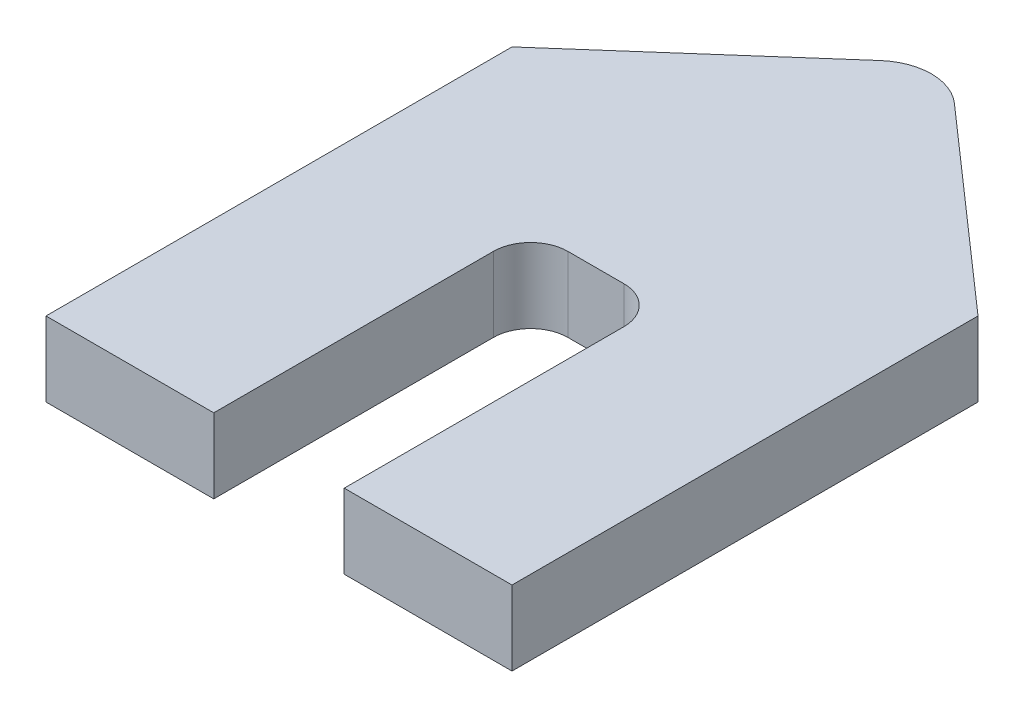
ISO-10303-21;
HEADER;
FILE_DESCRIPTION(('STEP AP214'),'2;1');
FILE_NAME('part.step','',(''),(''),'','','');
FILE_SCHEMA(('AUTOMOTIVE_DESIGN { 1 0 10303 214 1 1 1 1 }'));
ENDSEC;
DATA;
#1=APPLICATION_CONTEXT('core data for automotive mechanical design processes');
#2=APPLICATION_PROTOCOL_DEFINITION('international standard','automotive_design',2000,#1);
#3=PRODUCT_CONTEXT('',#1,'mechanical');
#4=PRODUCT('Part','Part','',(#3));
#5=PRODUCT_RELATED_PRODUCT_CATEGORY('part','',(#4));
#6=PRODUCT_DEFINITION_FORMATION('','',#4);
#7=PRODUCT_DEFINITION_CONTEXT('part definition',#1,'design');
#8=PRODUCT_DEFINITION('design','',#6,#7);
#9=PRODUCT_DEFINITION_SHAPE('','',#8);
#10=(LENGTH_UNIT() NAMED_UNIT(*) SI_UNIT(.MILLI.,.METRE.));
#11=(NAMED_UNIT(*) PLANE_ANGLE_UNIT() SI_UNIT($,.RADIAN.));
#12=(NAMED_UNIT(*) SI_UNIT($,.STERADIAN.) SOLID_ANGLE_UNIT());
#13=UNCERTAINTY_MEASURE_WITH_UNIT(LENGTH_MEASURE(1.E-05),#10,'distance_accuracy_value','');
#14=(GEOMETRIC_REPRESENTATION_CONTEXT(3) GLOBAL_UNCERTAINTY_ASSIGNED_CONTEXT((#13)) GLOBAL_UNIT_ASSIGNED_CONTEXT((#10,
#11,#12)) REPRESENTATION_CONTEXT('',''));
#15=CARTESIAN_POINT('',(0.,0.,0.));
#16=DIRECTION('',(0.,0.,1.));
#17=DIRECTION('',(1.,0.,0.));
#18=AXIS2_PLACEMENT_3D('',#15,#16,#17);
#19=CARTESIAN_POINT('',(-12.5,2.,12.5));
#20=DIRECTION('',(0.,0.,-1.));
#21=DIRECTION('',(-1.,0.,0.));
#22=AXIS2_PLACEMENT_3D('',#19,#20,#21);
#23=PLANE('',#22);
#24=DIRECTION('',(1.,0.,0.));
#25=VECTOR('',#24,1.);
#26=CARTESIAN_POINT('',(-12.5,-2.,12.5));
#27=LINE('',#26,#25);
#28=CARTESIAN_POINT('',(-12.5,-2.,12.5));
#29=VERTEX_POINT('',#28);
#30=CARTESIAN_POINT('',(-3.5,-2.,12.5));
#31=VERTEX_POINT('',#30);
#32=EDGE_CURVE('E123',#29,#31,#27,.T.);
#33=ORIENTED_EDGE('',*,*,#32,.T.);
#34=DIRECTION('',(0.,1.,0.));
#35=VECTOR('',#34,1.);
#36=CARTESIAN_POINT('',(-3.5,-2.001,12.5));
#37=LINE('',#36,#35);
#38=CARTESIAN_POINT('',(-3.5,2.,12.5));
#39=VERTEX_POINT('',#38);
#40=EDGE_CURVE('E129',#31,#39,#37,.T.);
#41=ORIENTED_EDGE('',*,*,#40,.T.);
#42=DIRECTION('',(1.,0.,0.));
#43=VECTOR('',#42,1.);
#44=CARTESIAN_POINT('',(-12.5,2.,12.5));
#45=LINE('',#44,#43);
#46=CARTESIAN_POINT('',(-12.5,2.,12.5));
#47=VERTEX_POINT('',#46);
#48=EDGE_CURVE('E226',#47,#39,#45,.T.);
#49=ORIENTED_EDGE('',*,*,#48,.F.);
#50=DIRECTION('',(0.,-1.,0.));
#51=VECTOR('',#50,1.);
#52=CARTESIAN_POINT('',(-12.5,2.,12.5));
#53=LINE('',#52,#51);
#54=EDGE_CURVE('E140',#47,#29,#53,.T.);
#55=ORIENTED_EDGE('',*,*,#54,.T.);
#56=EDGE_LOOP('',(#33,#41,#49,#55));
#57=FACE_BOUND('',#56,.T.);
#58=ADVANCED_FACE('F32',(#57),#23,.F.);
#59=CARTESIAN_POINT('',(12.5,2.,-12.5));
#60=DIRECTION('',(-0.660474933412196,0.,0.750848095378922));
#61=DIRECTION('',(0.750848095378922,0.,0.660474933412196));
#62=AXIS2_PLACEMENT_3D('',#59,#60,#61);
#63=PLANE('',#62);
#64=DIRECTION('',(-0.750848095378922,0.,-0.660474933412196));
#65=VECTOR('',#64,1.);
#66=CARTESIAN_POINT('',(12.5,-2.,-12.5));
#67=LINE('',#66,#65);
#68=CARTESIAN_POINT('',(12.5,-2.,-12.5));
#69=VERTEX_POINT('',#68);
#70=CARTESIAN_POINT('',(1.98142480023659,-2.,-21.7525442861368));
#71=VERTEX_POINT('',#70);
#72=EDGE_CURVE('E234',#69,#71,#67,.T.);
#73=ORIENTED_EDGE('',*,*,#72,.T.);
#74=DIRECTION('',(0.,-1.,0.));
#75=VECTOR('',#74,1.);
#76=CARTESIAN_POINT('',(1.98142480023659,2.,-21.7525442861368));
#77=LINE('',#76,#75);
#78=CARTESIAN_POINT('',(1.98142480023659,2.,-21.7525442861368));
#79=VERTEX_POINT('',#78);
#80=EDGE_CURVE('E164',#79,#71,#77,.T.);
#81=ORIENTED_EDGE('',*,*,#80,.F.);
#82=DIRECTION('',(-0.750848095378922,0.,-0.660474933412196));
#83=VECTOR('',#82,1.);
#84=CARTESIAN_POINT('',(12.5,2.,-12.5));
#85=LINE('',#84,#83);
#86=CARTESIAN_POINT('',(12.5,2.,-12.5));
#87=VERTEX_POINT('',#86);
#88=EDGE_CURVE('E144',#87,#79,#85,.T.);
#89=ORIENTED_EDGE('',*,*,#88,.F.);
#90=DIRECTION('',(0.,-1.,0.));
#91=VECTOR('',#90,1.);
#92=CARTESIAN_POINT('',(12.5,2.,-12.5));
#93=LINE('',#92,#91);
#94=EDGE_CURVE('E150',#87,#69,#93,.T.);
#95=ORIENTED_EDGE('',*,*,#94,.T.);
#96=EDGE_LOOP('',(#73,#81,#89,#95));
#97=FACE_BOUND('',#96,.T.);
#98=ADVANCED_FACE('F197',(#97),#63,.F.);
#99=CARTESIAN_POINT('',(0.,2.,-19.5));
#100=DIRECTION('',(0.,-1.,0.));
#101=DIRECTION('',(0.,0.,-1.));
#102=AXIS2_PLACEMENT_3D('',#99,#100,#101);
#103=CYLINDRICAL_SURFACE('',#102,3.);
#104=CARTESIAN_POINT('',(0.,-2.,-19.5));
#105=DIRECTION('',(0.,1.,0.));
#106=DIRECTION('',(0.,0.,-1.));
#107=AXIS2_PLACEMENT_3D('',#104,#105,#106);
#108=CIRCLE('',#107,3.);
#109=CARTESIAN_POINT('',(-1.98142480023659,-2.,-21.7525442861368));
#110=VERTEX_POINT('',#109);
#111=EDGE_CURVE('E237',#71,#110,#108,.T.);
#112=ORIENTED_EDGE('',*,*,#111,.T.);
#113=DIRECTION('',(0.,-1.,0.));
#114=VECTOR('',#113,1.);
#115=CARTESIAN_POINT('',(-1.98142480023659,2.,-21.7525442861368));
#116=LINE('',#115,#114);
#117=CARTESIAN_POINT('',(-1.98142480023659,2.,-21.7525442861368));
#118=VERTEX_POINT('',#117);
#119=EDGE_CURVE('E161',#118,#110,#116,.T.);
#120=ORIENTED_EDGE('',*,*,#119,.F.);
#121=CARTESIAN_POINT('',(0.,2.,-19.5));
#122=DIRECTION('',(0.,1.,0.));
#123=DIRECTION('',(0.,0.,-1.));
#124=AXIS2_PLACEMENT_3D('',#121,#122,#123);
#125=CIRCLE('',#124,3.);
#126=EDGE_CURVE('E248',#79,#118,#125,.T.);
#127=ORIENTED_EDGE('',*,*,#126,.F.);
#128=ORIENTED_EDGE('',*,*,#80,.T.);
#129=EDGE_LOOP('',(#112,#120,#127,#128));
#130=FACE_BOUND('',#129,.T.);
#131=ADVANCED_FACE('F203',(#130),#103,.T.);
#132=CARTESIAN_POINT('',(-12.5,2.,-12.5));
#133=DIRECTION('',(0.660474933412196,0.,0.750848095378922));
#134=DIRECTION('',(0.750848095378922,0.,-0.660474933412196));
#135=AXIS2_PLACEMENT_3D('',#132,#133,#134);
#136=PLANE('',#135);
#137=DIRECTION('',(-0.750848095378922,0.,0.660474933412196));
#138=VECTOR('',#137,1.);
#139=CARTESIAN_POINT('',(-12.5,-2.,-12.5));
#140=LINE('',#139,#138);
#141=CARTESIAN_POINT('',(-12.5,-2.,-12.5));
#142=VERTEX_POINT('',#141);
#143=EDGE_CURVE('E238',#110,#142,#140,.T.);
#144=ORIENTED_EDGE('',*,*,#143,.T.);
#145=DIRECTION('',(0.,-1.,0.));
#146=VECTOR('',#145,1.);
#147=CARTESIAN_POINT('',(-12.5,2.,-12.5));
#148=LINE('',#147,#146);
#149=CARTESIAN_POINT('',(-12.5,2.,-12.5));
#150=VERTEX_POINT('',#149);
#151=EDGE_CURVE('E158',#150,#142,#148,.T.);
#152=ORIENTED_EDGE('',*,*,#151,.F.);
#153=DIRECTION('',(-0.750848095378922,0.,0.660474933412196));
#154=VECTOR('',#153,1.);
#155=CARTESIAN_POINT('',(-12.5,2.,-12.5));
#156=LINE('',#155,#154);
#157=EDGE_CURVE('E229',#118,#150,#156,.T.);
#158=ORIENTED_EDGE('',*,*,#157,.F.);
#159=ORIENTED_EDGE('',*,*,#119,.T.);
#160=EDGE_LOOP('',(#144,#152,#158,#159));
#161=FACE_BOUND('',#160,.T.);
#162=ADVANCED_FACE('F217',(#161),#136,.F.);
#163=CARTESIAN_POINT('',(-12.5,2.,12.5));
#164=DIRECTION('',(1.,0.,0.));
#165=DIRECTION('',(0.,0.,-1.));
#166=AXIS2_PLACEMENT_3D('',#163,#164,#165);
#167=PLANE('',#166);
#168=DIRECTION('',(0.,0.,1.));
#169=VECTOR('',#168,1.);
#170=CARTESIAN_POINT('',(-12.5,-2.,12.5));
#171=LINE('',#170,#169);
#172=EDGE_CURVE('E146',#142,#29,#171,.T.);
#173=ORIENTED_EDGE('',*,*,#172,.T.);
#174=ORIENTED_EDGE('',*,*,#54,.F.);
#175=DIRECTION('',(0.,0.,1.));
#176=VECTOR('',#175,1.);
#177=CARTESIAN_POINT('',(-12.5,2.,12.5));
#178=LINE('',#177,#176);
#179=EDGE_CURVE('E227',#150,#47,#178,.T.);
#180=ORIENTED_EDGE('',*,*,#179,.F.);
#181=ORIENTED_EDGE('',*,*,#151,.T.);
#182=EDGE_LOOP('',(#173,#174,#180,#181));
#183=FACE_BOUND('',#182,.T.);
#184=ADVANCED_FACE('F210',(#183),#167,.F.);
#185=CARTESIAN_POINT('',(3.5,2.,12.5));
#186=VERTEX_POINT('',#185);
#187=CARTESIAN_POINT('',(12.5,2.,12.5));
#188=VERTEX_POINT('',#187);
#189=EDGE_CURVE('E222',#186,#188,#45,.T.);
#190=ORIENTED_EDGE('',*,*,#189,.F.);
#191=DIRECTION('',(0.,1.,0.));
#192=VECTOR('',#191,1.);
#193=CARTESIAN_POINT('',(3.5,-2.001,12.5));
#194=LINE('',#193,#192);
#195=CARTESIAN_POINT('',(3.5,-2.,12.5));
#196=VERTEX_POINT('',#195);
#197=EDGE_CURVE('E135',#196,#186,#194,.T.);
#198=ORIENTED_EDGE('',*,*,#197,.F.);
#199=CARTESIAN_POINT('',(12.5,-2.,12.5));
#200=VERTEX_POINT('',#199);
#201=EDGE_CURVE('E142',#196,#200,#27,.T.);
#202=ORIENTED_EDGE('',*,*,#201,.T.);
#203=DIRECTION('',(0.,-1.,0.));
#204=VECTOR('',#203,1.);
#205=CARTESIAN_POINT('',(12.5,2.,12.5));
#206=LINE('',#205,#204);
#207=EDGE_CURVE('E153',#188,#200,#206,.T.);
#208=ORIENTED_EDGE('',*,*,#207,.F.);
#209=EDGE_LOOP('',(#190,#198,#202,#208));
#210=FACE_BOUND('',#209,.T.);
#211=ADVANCED_FACE('F199',(#210),#23,.F.);
#212=CARTESIAN_POINT('',(12.5,2.,12.5));
#213=DIRECTION('',(-1.,0.,0.));
#214=DIRECTION('',(0.,0.,1.));
#215=AXIS2_PLACEMENT_3D('',#212,#213,#214);
#216=PLANE('',#215);
#217=DIRECTION('',(0.,0.,-1.));
#218=VECTOR('',#217,1.);
#219=CARTESIAN_POINT('',(12.5,-2.,12.5));
#220=LINE('',#219,#218);
#221=EDGE_CURVE('E141',#200,#69,#220,.T.);
#222=ORIENTED_EDGE('',*,*,#221,.T.);
#223=ORIENTED_EDGE('',*,*,#94,.F.);
#224=DIRECTION('',(0.,0.,-1.));
#225=VECTOR('',#224,1.);
#226=CARTESIAN_POINT('',(12.5,2.,12.5));
#227=LINE('',#226,#225);
#228=EDGE_CURVE('E154',#188,#87,#227,.T.);
#229=ORIENTED_EDGE('',*,*,#228,.F.);
#230=ORIENTED_EDGE('',*,*,#207,.T.);
#231=EDGE_LOOP('',(#222,#223,#229,#230));
#232=FACE_BOUND('',#231,.T.);
#233=ADVANCED_FACE('F209',(#232),#216,.F.);
#234=CARTESIAN_POINT('',(0.,2.,-19.5));
#235=DIRECTION('',(0.,-1.,0.));
#236=DIRECTION('',(0.,0.,-1.));
#237=AXIS2_PLACEMENT_3D('',#234,#235,#236);
#238=PLANE('',#237);
#239=ORIENTED_EDGE('',*,*,#48,.T.);
#240=DIRECTION('',(0.,0.,1.));
#241=VECTOR('',#240,1.);
#242=CARTESIAN_POINT('',(-3.5,2.,12.5));
#243=LINE('',#242,#241);
#244=CARTESIAN_POINT('',(-3.5,2.,-2.5));
#245=VERTEX_POINT('',#244);
#246=EDGE_CURVE('E125',#245,#39,#243,.T.);
#247=ORIENTED_EDGE('',*,*,#246,.F.);
#248=CARTESIAN_POINT('',(-1.5,2.,-2.5));
#249=DIRECTION('',(0.,-1.,0.));
#250=DIRECTION('',(0.,0.,-1.));
#251=AXIS2_PLACEMENT_3D('',#248,#249,#250);
#252=CIRCLE('',#251,2.);
#253=CARTESIAN_POINT('',(-1.5,2.,-4.5));
#254=VERTEX_POINT('',#253);
#255=EDGE_CURVE('E40',#245,#254,#252,.T.);
#256=ORIENTED_EDGE('',*,*,#255,.T.);
#257=DIRECTION('',(-1.,0.,0.));
#258=VECTOR('',#257,1.);
#259=CARTESIAN_POINT('',(-3.5,2.,-4.5));
#260=LINE('',#259,#258);
#261=CARTESIAN_POINT('',(1.5,2.,-4.5));
#262=VERTEX_POINT('',#261);
#263=EDGE_CURVE('E136',#262,#254,#260,.T.);
#264=ORIENTED_EDGE('',*,*,#263,.F.);
#265=CARTESIAN_POINT('',(1.5,2.,-2.5));
#266=DIRECTION('',(0.,-1.,0.));
#267=DIRECTION('',(0.,0.,-1.));
#268=AXIS2_PLACEMENT_3D('',#265,#266,#267);
#269=CIRCLE('',#268,2.);
#270=CARTESIAN_POINT('',(3.5,2.,-2.5));
#271=VERTEX_POINT('',#270);
#272=EDGE_CURVE('E176',#262,#271,#269,.T.);
#273=ORIENTED_EDGE('',*,*,#272,.T.);
#274=DIRECTION('',(0.,0.,-1.));
#275=VECTOR('',#274,1.);
#276=CARTESIAN_POINT('',(3.5,2.,12.5));
#277=LINE('',#276,#275);
#278=EDGE_CURVE('E187',#186,#271,#277,.T.);
#279=ORIENTED_EDGE('',*,*,#278,.F.);
#280=ORIENTED_EDGE('',*,*,#189,.T.);
#281=ORIENTED_EDGE('',*,*,#228,.T.);
#282=ORIENTED_EDGE('',*,*,#88,.T.);
#283=ORIENTED_EDGE('',*,*,#126,.T.);
#284=ORIENTED_EDGE('',*,*,#157,.T.);
#285=ORIENTED_EDGE('',*,*,#179,.T.);
#286=EDGE_LOOP('',(#239,#247,#256,#264,#273,#279,#280,#281,#282,#283,#284,#285));
#287=FACE_BOUND('',#286,.T.);
#288=ADVANCED_FACE('F182',(#287),#238,.F.);
#289=CARTESIAN_POINT('',(0.,-2.,-19.5));
#290=DIRECTION('',(0.,-1.,0.));
#291=DIRECTION('',(0.,0.,-1.));
#292=AXIS2_PLACEMENT_3D('',#289,#290,#291);
#293=PLANE('',#292);
#294=DIRECTION('',(-1.,0.,0.));
#295=VECTOR('',#294,1.);
#296=CARTESIAN_POINT('',(-3.5,-2.,-4.5));
#297=LINE('',#296,#295);
#298=CARTESIAN_POINT('',(1.5,-2.,-4.5));
#299=VERTEX_POINT('',#298);
#300=CARTESIAN_POINT('',(-1.5,-2.,-4.5));
#301=VERTEX_POINT('',#300);
#302=EDGE_CURVE('E126',#299,#301,#297,.T.);
#303=ORIENTED_EDGE('',*,*,#302,.T.);
#304=CARTESIAN_POINT('',(-1.5,-2.,-2.5));
#305=DIRECTION('',(0.,-1.,0.));
#306=DIRECTION('',(0.,0.,-1.));
#307=AXIS2_PLACEMENT_3D('',#304,#305,#306);
#308=CIRCLE('',#307,2.);
#309=CARTESIAN_POINT('',(-3.5,-2.,-2.5));
#310=VERTEX_POINT('',#309);
#311=EDGE_CURVE('E11',#301,#310,#308,.F.);
#312=ORIENTED_EDGE('',*,*,#311,.T.);
#313=DIRECTION('',(0.,0.,1.));
#314=VECTOR('',#313,1.);
#315=CARTESIAN_POINT('',(-3.5,-2.,12.5));
#316=LINE('',#315,#314);
#317=EDGE_CURVE('E118',#310,#31,#316,.T.);
#318=ORIENTED_EDGE('',*,*,#317,.T.);
#319=ORIENTED_EDGE('',*,*,#32,.F.);
#320=ORIENTED_EDGE('',*,*,#172,.F.);
#321=ORIENTED_EDGE('',*,*,#143,.F.);
#322=ORIENTED_EDGE('',*,*,#111,.F.);
#323=ORIENTED_EDGE('',*,*,#72,.F.);
#324=ORIENTED_EDGE('',*,*,#221,.F.);
#325=ORIENTED_EDGE('',*,*,#201,.F.);
#326=DIRECTION('',(0.,0.,-1.));
#327=VECTOR('',#326,1.);
#328=CARTESIAN_POINT('',(3.5,-2.,12.5));
#329=LINE('',#328,#327);
#330=CARTESIAN_POINT('',(3.5,-2.,-2.5));
#331=VERTEX_POINT('',#330);
#332=EDGE_CURVE('E253',#196,#331,#329,.T.);
#333=ORIENTED_EDGE('',*,*,#332,.T.);
#334=CARTESIAN_POINT('',(1.5,-2.,-2.5));
#335=DIRECTION('',(0.,-1.,0.));
#336=DIRECTION('',(0.,0.,-1.));
#337=AXIS2_PLACEMENT_3D('',#334,#335,#336);
#338=CIRCLE('',#337,2.);
#339=EDGE_CURVE('E178',#331,#299,#338,.F.);
#340=ORIENTED_EDGE('',*,*,#339,.T.);
#341=EDGE_LOOP('',(#303,#312,#318,#319,#320,#321,#322,#323,#324,#325,#333,#340));
#342=FACE_BOUND('',#341,.T.);
#343=ADVANCED_FACE('F120',(#342),#293,.T.);
#344=CARTESIAN_POINT('',(-3.5,-2.001,12.5));
#345=DIRECTION('',(-1.,0.,0.));
#346=DIRECTION('',(0.,0.,1.));
#347=AXIS2_PLACEMENT_3D('',#344,#345,#346);
#348=PLANE('',#347);
#349=ORIENTED_EDGE('',*,*,#317,.F.);
#350=DIRECTION('',(0.,1.,0.));
#351=VECTOR('',#350,1.);
#352=CARTESIAN_POINT('',(-3.5,2.,-2.5));
#353=LINE('',#352,#351);
#354=EDGE_CURVE('E174',#310,#245,#353,.T.);
#355=ORIENTED_EDGE('',*,*,#354,.T.);
#356=ORIENTED_EDGE('',*,*,#246,.T.);
#357=ORIENTED_EDGE('',*,*,#40,.F.);
#358=EDGE_LOOP('',(#349,#355,#356,#357));
#359=FACE_BOUND('',#358,.T.);
#360=ADVANCED_FACE('F130',(#359),#348,.F.);
#361=CARTESIAN_POINT('',(-3.5,-2.001,-4.5));
#362=DIRECTION('',(0.,0.,-1.));
#363=DIRECTION('',(-1.,0.,0.));
#364=AXIS2_PLACEMENT_3D('',#361,#362,#363);
#365=PLANE('',#364);
#366=ORIENTED_EDGE('',*,*,#302,.F.);
#367=DIRECTION('',(0.,1.,0.));
#368=VECTOR('',#367,1.);
#369=CARTESIAN_POINT('',(1.5,2.,-4.5));
#370=LINE('',#369,#368);
#371=EDGE_CURVE('E169',#299,#262,#370,.T.);
#372=ORIENTED_EDGE('',*,*,#371,.T.);
#373=ORIENTED_EDGE('',*,*,#263,.T.);
#374=DIRECTION('',(0.,1.,0.));
#375=VECTOR('',#374,1.);
#376=CARTESIAN_POINT('',(-1.5,-2.,-4.5));
#377=LINE('',#376,#375);
#378=EDGE_CURVE('E167',#254,#301,#377,.F.);
#379=ORIENTED_EDGE('',*,*,#378,.T.);
#380=EDGE_LOOP('',(#366,#372,#373,#379));
#381=FACE_BOUND('',#380,.T.);
#382=ADVANCED_FACE('F185',(#381),#365,.F.);
#383=CARTESIAN_POINT('',(3.5,-2.001,12.5));
#384=DIRECTION('',(1.,0.,0.));
#385=DIRECTION('',(0.,0.,-1.));
#386=AXIS2_PLACEMENT_3D('',#383,#384,#385);
#387=PLANE('',#386);
#388=ORIENTED_EDGE('',*,*,#278,.T.);
#389=DIRECTION('',(0.,1.,0.));
#390=VECTOR('',#389,1.);
#391=CARTESIAN_POINT('',(3.5,-2.,-2.5));
#392=LINE('',#391,#390);
#393=EDGE_CURVE('E172',#271,#331,#392,.F.);
#394=ORIENTED_EDGE('',*,*,#393,.T.);
#395=ORIENTED_EDGE('',*,*,#332,.F.);
#396=ORIENTED_EDGE('',*,*,#197,.T.);
#397=EDGE_LOOP('',(#388,#394,#395,#396));
#398=FACE_BOUND('',#397,.T.);
#399=ADVANCED_FACE('F194',(#398),#387,.F.);
#400=CARTESIAN_POINT('',(1.5,-2.001,-2.5));
#401=DIRECTION('',(0.,-1.,0.));
#402=DIRECTION('',(0.,0.,-1.));
#403=AXIS2_PLACEMENT_3D('',#400,#401,#402);
#404=CYLINDRICAL_SURFACE('',#403,2.);
#405=ORIENTED_EDGE('',*,*,#339,.F.);
#406=ORIENTED_EDGE('',*,*,#393,.F.);
#407=ORIENTED_EDGE('',*,*,#272,.F.);
#408=ORIENTED_EDGE('',*,*,#371,.F.);
#409=EDGE_LOOP('',(#405,#406,#407,#408));
#410=FACE_BOUND('',#409,.T.);
#411=ADVANCED_FACE('F190',(#410),#404,.F.);
#412=CARTESIAN_POINT('',(-1.5,-2.001,-2.5));
#413=DIRECTION('',(0.,-1.,0.));
#414=DIRECTION('',(0.,0.,-1.));
#415=AXIS2_PLACEMENT_3D('',#412,#413,#414);
#416=CYLINDRICAL_SURFACE('',#415,2.);
#417=ORIENTED_EDGE('',*,*,#311,.F.);
#418=ORIENTED_EDGE('',*,*,#378,.F.);
#419=ORIENTED_EDGE('',*,*,#255,.F.);
#420=ORIENTED_EDGE('',*,*,#354,.F.);
#421=EDGE_LOOP('',(#417,#418,#419,#420));
#422=FACE_BOUND('',#421,.T.);
#423=ADVANCED_FACE('F34',(#422),#416,.F.);
#424=CLOSED_SHELL('',(#58,#98,#131,#162,#184,#211,#233,#288,#343,#360,#382,#399,#411,#423));
#425=MANIFOLD_SOLID_BREP('B2',#424);
#426=ADVANCED_BREP_SHAPE_REPRESENTATION('',(#18,#425),#14);
#427=SHAPE_DEFINITION_REPRESENTATION(#9,#426);
ENDSEC;
END-ISO-10303-21;
